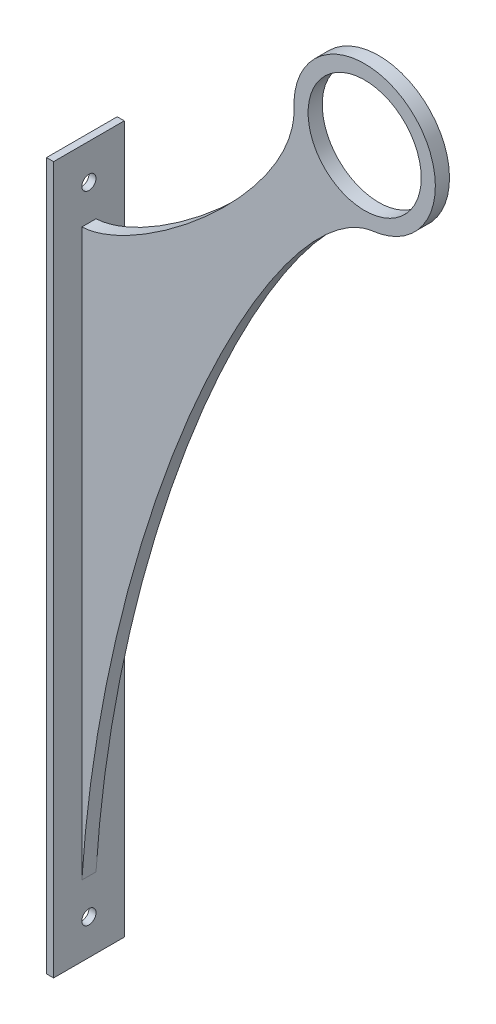
ISO-10303-21;
HEADER;
FILE_DESCRIPTION(('STEP AP214'),'2;1');
FILE_NAME('part.step','',(''),(''),'','','');
FILE_SCHEMA(('AUTOMOTIVE_DESIGN { 1 0 10303 214 1 1 1 1 }'));
ENDSEC;
DATA;
#1=APPLICATION_CONTEXT('core data for automotive mechanical design processes');
#2=APPLICATION_PROTOCOL_DEFINITION('international standard','automotive_design',2000,#1);
#3=PRODUCT_CONTEXT('',#1,'mechanical');
#4=PRODUCT('Part','Part','',(#3));
#5=PRODUCT_RELATED_PRODUCT_CATEGORY('part','',(#4));
#6=PRODUCT_DEFINITION_FORMATION('','',#4);
#7=PRODUCT_DEFINITION_CONTEXT('part definition',#1,'design');
#8=PRODUCT_DEFINITION('design','',#6,#7);
#9=PRODUCT_DEFINITION_SHAPE('','',#8);
#10=(LENGTH_UNIT() NAMED_UNIT(*) SI_UNIT(.MILLI.,.METRE.));
#11=(NAMED_UNIT(*) PLANE_ANGLE_UNIT() SI_UNIT($,.RADIAN.));
#12=(NAMED_UNIT(*) SI_UNIT($,.STERADIAN.) SOLID_ANGLE_UNIT());
#13=UNCERTAINTY_MEASURE_WITH_UNIT(LENGTH_MEASURE(1.E-05),#10,'distance_accuracy_value','');
#14=(GEOMETRIC_REPRESENTATION_CONTEXT(3) GLOBAL_UNCERTAINTY_ASSIGNED_CONTEXT((#13)) GLOBAL_UNIT_ASSIGNED_CONTEXT((#10,
#11,#12)) REPRESENTATION_CONTEXT('',''));
#15=CARTESIAN_POINT('',(0.,0.,0.));
#16=DIRECTION('',(0.,0.,1.));
#17=DIRECTION('',(1.,0.,0.));
#18=AXIS2_PLACEMENT_3D('',#15,#16,#17);
#19=CARTESIAN_POINT('',(51.,0.,-1.00000000000001));
#20=DIRECTION('',(0.,0.,-1.));
#21=DIRECTION('',(0.,1.,0.));
#22=AXIS2_PLACEMENT_3D('',#19,#20,#21);
#23=PLANE('',#22);
#24=CARTESIAN_POINT('',(41.,70.,-1.));
#25=DIRECTION('',(0.,0.,-1.));
#26=DIRECTION('',(0.,1.,0.));
#27=AXIS2_PLACEMENT_3D('',#24,#25,#26);
#28=CIRCLE('',#27,8.);
#29=CARTESIAN_POINT('',(41.,78.,-1.));
#30=VERTEX_POINT('',#29);
#31=EDGE_CURVE('E240',#30,#30,#28,.T.);
#32=ORIENTED_EDGE('',*,*,#31,.F.);
#33=EDGE_LOOP('',(#32));
#34=FACE_BOUND('',#33,.T.);
#35=CARTESIAN_POINT('',(1.,40.,-1.00000000000001));
#36=CARTESIAN_POINT('',(9.64918232550717,40.4235237753895,-1.00000000000001));
#37=CARTESIAN_POINT('',(31.8724041452794,58.9217393643357,-1.00000000000001));
#38=CARTESIAN_POINT('',(31.,70.,-1.00000000000001));
#39=B_SPLINE_CURVE_WITH_KNOTS('',3,(#35,#36,#37,#38),.UNSPECIFIED.,.F.,.F.,(4,4),(0.,1.),.UNSPECIFIED.);
#40=CARTESIAN_POINT('',(31.0247735883734,69.2965385321235,-1.00000000000001));
#41=VERTEX_POINT('',#40);
#42=CARTESIAN_POINT('',(1.,40.,-1.00000000000001));
#43=VERTEX_POINT('',#42);
#44=EDGE_CURVE('E248',#41,#43,#39,.F.);
#45=ORIENTED_EDGE('',*,*,#44,.F.);
#46=CARTESIAN_POINT('',(41.,70.,-1.));
#47=DIRECTION('',(0.,0.,-1.));
#48=DIRECTION('',(0.,1.,0.));
#49=AXIS2_PLACEMENT_3D('',#46,#47,#48);
#50=CIRCLE('',#49,10.);
#51=CARTESIAN_POINT('',(42.1006942420899,60.060760985597,-1.));
#52=VERTEX_POINT('',#51);
#53=EDGE_CURVE('E309',#41,#52,#50,.T.);
#54=ORIENTED_EDGE('',*,*,#53,.T.);
#55=CARTESIAN_POINT('',(1.,-40.,-1.00000000000001));
#56=CARTESIAN_POINT('',(4.19474836503563,9.50313980272918,-1.00000000000001));
#57=CARTESIAN_POINT('',(28.5702411086224,58.1745367645493,-1.00000000000001));
#58=CARTESIAN_POINT('',(42.1006942420899,60.060760985597,-1.00000000000001));
#59=B_SPLINE_CURVE_WITH_KNOTS('',3,(#55,#56,#57,#58),.UNSPECIFIED.,.F.,.F.,(4,4),(0.,1.),.UNSPECIFIED.);
#60=CARTESIAN_POINT('',(1.,-40.,-1.));
#61=VERTEX_POINT('',#60);
#62=EDGE_CURVE('E296',#52,#61,#59,.F.);
#63=ORIENTED_EDGE('',*,*,#62,.T.);
#64=DIRECTION('',(0.,-1.,0.));
#65=VECTOR('',#64,1.);
#66=CARTESIAN_POINT('',(1.,0.,-1.00000000000001));
#67=LINE('',#66,#65);
#68=EDGE_CURVE('E12',#43,#61,#67,.T.);
#69=ORIENTED_EDGE('',*,*,#68,.F.);
#70=EDGE_LOOP('',(#45,#54,#63,#69));
#71=FACE_BOUND('',#70,.T.);
#72=ADVANCED_FACE('F153',(#34,#71),#23,.T.);
#73=CARTESIAN_POINT('',(51.,0.,1.));
#74=DIRECTION('',(0.,0.,1.));
#75=DIRECTION('',(1.,0.,0.));
#76=AXIS2_PLACEMENT_3D('',#73,#74,#75);
#77=PLANE('',#76);
#78=CARTESIAN_POINT('',(41.,70.,1.));
#79=DIRECTION('',(0.,0.,1.));
#80=DIRECTION('',(1.,0.,0.));
#81=AXIS2_PLACEMENT_3D('',#78,#79,#80);
#82=CIRCLE('',#81,8.);
#83=CARTESIAN_POINT('',(49.,70.,1.));
#84=VERTEX_POINT('',#83);
#85=EDGE_CURVE('E494',#84,#84,#82,.T.);
#86=ORIENTED_EDGE('',*,*,#85,.F.);
#87=EDGE_LOOP('',(#86));
#88=FACE_BOUND('',#87,.T.);
#89=CARTESIAN_POINT('',(41.,70.,1.));
#90=DIRECTION('',(0.,0.,1.));
#91=DIRECTION('',(1.,0.,0.));
#92=AXIS2_PLACEMENT_3D('',#89,#90,#91);
#93=CIRCLE('',#92,10.);
#94=CARTESIAN_POINT('',(42.1006942420899,60.060760985597,1.));
#95=VERTEX_POINT('',#94);
#96=CARTESIAN_POINT('',(31.0247735883734,69.2965385321235,1.));
#97=VERTEX_POINT('',#96);
#98=EDGE_CURVE('E239',#95,#97,#93,.T.);
#99=ORIENTED_EDGE('',*,*,#98,.T.);
#100=CARTESIAN_POINT('',(1.,40.,1.));
#101=CARTESIAN_POINT('',(9.64918232550717,40.4235237753895,1.));
#102=CARTESIAN_POINT('',(31.8724041452794,58.9217393643357,1.));
#103=CARTESIAN_POINT('',(31.,70.,1.));
#104=B_SPLINE_CURVE_WITH_KNOTS('',3,(#100,#101,#102,#103),.UNSPECIFIED.,.F.,.F.,(4,4),(0.,1.),.UNSPECIFIED.);
#105=CARTESIAN_POINT('',(1.,40.,1.));
#106=VERTEX_POINT('',#105);
#107=EDGE_CURVE('E245',#106,#97,#104,.T.);
#108=ORIENTED_EDGE('',*,*,#107,.F.);
#109=DIRECTION('',(0.,1.,0.));
#110=VECTOR('',#109,1.);
#111=CARTESIAN_POINT('',(1.,0.,1.));
#112=LINE('',#111,#110);
#113=CARTESIAN_POINT('',(1.,-40.,1.));
#114=VERTEX_POINT('',#113);
#115=EDGE_CURVE('E243',#114,#106,#112,.T.);
#116=ORIENTED_EDGE('',*,*,#115,.F.);
#117=CARTESIAN_POINT('',(1.,-40.,1.));
#118=CARTESIAN_POINT('',(4.19474836503563,9.50313980272918,1.));
#119=CARTESIAN_POINT('',(28.5702411086224,58.1745367645493,1.));
#120=CARTESIAN_POINT('',(42.1006942420899,60.060760985597,1.));
#121=B_SPLINE_CURVE_WITH_KNOTS('',3,(#117,#118,#119,#120),.UNSPECIFIED.,.F.,.F.,(4,4),(0.,1.),.UNSPECIFIED.);
#122=EDGE_CURVE('E228',#114,#95,#121,.T.);
#123=ORIENTED_EDGE('',*,*,#122,.T.);
#124=EDGE_LOOP('',(#99,#108,#116,#123));
#125=FACE_BOUND('',#124,.T.);
#126=ADVANCED_FACE('F244',(#88,#125),#77,.T.);
#127=CARTESIAN_POINT('',(1.,-50.,-5.));
#128=DIRECTION('',(0.,0.,1.));
#129=DIRECTION('',(1.,0.,0.));
#130=AXIS2_PLACEMENT_3D('',#127,#128,#129);
#131=PLANE('',#130);
#132=DIRECTION('',(0.,1.,0.));
#133=VECTOR('',#132,1.);
#134=CARTESIAN_POINT('',(0.,-50.,-5.));
#135=LINE('',#134,#133);
#136=CARTESIAN_POINT('',(0.,-50.,-5.));
#137=VERTEX_POINT('',#136);
#138=CARTESIAN_POINT('',(0.,50.,-5.));
#139=VERTEX_POINT('',#138);
#140=EDGE_CURVE('E253',#137,#139,#135,.T.);
#141=ORIENTED_EDGE('',*,*,#140,.T.);
#142=DIRECTION('',(-1.,0.,0.));
#143=VECTOR('',#142,1.);
#144=CARTESIAN_POINT('',(1.,50.,-5.));
#145=LINE('',#144,#143);
#146=CARTESIAN_POINT('',(1.,50.,-5.));
#147=VERTEX_POINT('',#146);
#148=EDGE_CURVE('E163',#147,#139,#145,.T.);
#149=ORIENTED_EDGE('',*,*,#148,.F.);
#150=DIRECTION('',(0.,1.,0.));
#151=VECTOR('',#150,1.);
#152=CARTESIAN_POINT('',(1.,-50.,-5.));
#153=LINE('',#152,#151);
#154=CARTESIAN_POINT('',(1.,-50.,-5.));
#155=VERTEX_POINT('',#154);
#156=EDGE_CURVE('E205',#155,#147,#153,.T.);
#157=ORIENTED_EDGE('',*,*,#156,.F.);
#158=DIRECTION('',(-1.,0.,0.));
#159=VECTOR('',#158,1.);
#160=CARTESIAN_POINT('',(1.,-50.,-5.));
#161=LINE('',#160,#159);
#162=EDGE_CURVE('E271',#155,#137,#161,.T.);
#163=ORIENTED_EDGE('',*,*,#162,.T.);
#164=EDGE_LOOP('',(#141,#149,#157,#163));
#165=FACE_BOUND('',#164,.T.);
#166=ADVANCED_FACE('F155',(#165),#131,.F.);
#167=CARTESIAN_POINT('',(1.,50.,5.));
#168=DIRECTION('',(0.,-1.,0.));
#169=DIRECTION('',(0.,0.,-1.));
#170=AXIS2_PLACEMENT_3D('',#167,#168,#169);
#171=PLANE('',#170);
#172=DIRECTION('',(0.,0.,1.));
#173=VECTOR('',#172,1.);
#174=CARTESIAN_POINT('',(0.,50.,5.));
#175=LINE('',#174,#173);
#176=CARTESIAN_POINT('',(0.,50.,5.));
#177=VERTEX_POINT('',#176);
#178=EDGE_CURVE('E257',#139,#177,#175,.T.);
#179=ORIENTED_EDGE('',*,*,#178,.T.);
#180=DIRECTION('',(-1.,0.,0.));
#181=VECTOR('',#180,1.);
#182=CARTESIAN_POINT('',(1.,50.,5.));
#183=LINE('',#182,#181);
#184=CARTESIAN_POINT('',(1.,50.,5.));
#185=VERTEX_POINT('',#184);
#186=EDGE_CURVE('E264',#185,#177,#183,.T.);
#187=ORIENTED_EDGE('',*,*,#186,.F.);
#188=DIRECTION('',(0.,0.,1.));
#189=VECTOR('',#188,1.);
#190=CARTESIAN_POINT('',(1.,50.,5.));
#191=LINE('',#190,#189);
#192=EDGE_CURVE('E286',#147,#185,#191,.T.);
#193=ORIENTED_EDGE('',*,*,#192,.F.);
#194=ORIENTED_EDGE('',*,*,#148,.T.);
#195=EDGE_LOOP('',(#179,#187,#193,#194));
#196=FACE_BOUND('',#195,.T.);
#197=ADVANCED_FACE('F361',(#196),#171,.F.);
#198=CARTESIAN_POINT('',(1.,-50.,5.));
#199=DIRECTION('',(0.,0.,-1.));
#200=DIRECTION('',(-1.,0.,0.));
#201=AXIS2_PLACEMENT_3D('',#198,#199,#200);
#202=PLANE('',#201);
#203=DIRECTION('',(0.,-1.,0.));
#204=VECTOR('',#203,1.);
#205=CARTESIAN_POINT('',(0.,-50.,5.));
#206=LINE('',#205,#204);
#207=CARTESIAN_POINT('',(0.,-50.,5.));
#208=VERTEX_POINT('',#207);
#209=EDGE_CURVE('E276',#177,#208,#206,.T.);
#210=ORIENTED_EDGE('',*,*,#209,.T.);
#211=DIRECTION('',(-1.,0.,0.));
#212=VECTOR('',#211,1.);
#213=CARTESIAN_POINT('',(1.,-50.,5.));
#214=LINE('',#213,#212);
#215=CARTESIAN_POINT('',(1.,-50.,5.));
#216=VERTEX_POINT('',#215);
#217=EDGE_CURVE('E268',#216,#208,#214,.T.);
#218=ORIENTED_EDGE('',*,*,#217,.F.);
#219=DIRECTION('',(0.,-1.,0.));
#220=VECTOR('',#219,1.);
#221=CARTESIAN_POINT('',(1.,-50.,5.));
#222=LINE('',#221,#220);
#223=EDGE_CURVE('E283',#185,#216,#222,.T.);
#224=ORIENTED_EDGE('',*,*,#223,.F.);
#225=ORIENTED_EDGE('',*,*,#186,.T.);
#226=EDGE_LOOP('',(#210,#218,#224,#225));
#227=FACE_BOUND('',#226,.T.);
#228=ADVANCED_FACE('F359',(#227),#202,.F.);
#229=CARTESIAN_POINT('',(1.,-50.,5.));
#230=DIRECTION('',(0.,1.,0.));
#231=DIRECTION('',(0.,0.,1.));
#232=AXIS2_PLACEMENT_3D('',#229,#230,#231);
#233=PLANE('',#232);
#234=DIRECTION('',(0.,0.,-1.));
#235=VECTOR('',#234,1.);
#236=CARTESIAN_POINT('',(0.,-50.,5.));
#237=LINE('',#236,#235);
#238=EDGE_CURVE('E200',#208,#137,#237,.T.);
#239=ORIENTED_EDGE('',*,*,#238,.T.);
#240=ORIENTED_EDGE('',*,*,#162,.F.);
#241=DIRECTION('',(0.,0.,-1.));
#242=VECTOR('',#241,1.);
#243=CARTESIAN_POINT('',(1.,-50.,5.));
#244=LINE('',#243,#242);
#245=EDGE_CURVE('E179',#216,#155,#244,.T.);
#246=ORIENTED_EDGE('',*,*,#245,.F.);
#247=ORIENTED_EDGE('',*,*,#217,.T.);
#248=EDGE_LOOP('',(#239,#240,#246,#247));
#249=FACE_BOUND('',#248,.T.);
#250=ADVANCED_FACE('F352',(#249),#233,.F.);
#251=CARTESIAN_POINT('',(1.,0.,0.));
#252=DIRECTION('',(-1.,0.,0.));
#253=DIRECTION('',(0.,0.,1.));
#254=AXIS2_PLACEMENT_3D('',#251,#252,#253);
#255=PLANE('',#254);
#256=CARTESIAN_POINT('',(1.,-45.,0.));
#257=DIRECTION('',(-1.,0.,0.));
#258=DIRECTION('',(0.,0.,1.));
#259=AXIS2_PLACEMENT_3D('',#256,#257,#258);
#260=CIRCLE('',#259,1.);
#261=CARTESIAN_POINT('',(1.,-45.,1.));
#262=VERTEX_POINT('',#261);
#263=EDGE_CURVE('E480',#262,#262,#260,.T.);
#264=ORIENTED_EDGE('',*,*,#263,.T.);
#265=EDGE_LOOP('',(#264));
#266=FACE_BOUND('',#265,.T.);
#267=CARTESIAN_POINT('',(1.,44.9643549782266,0.));
#268=DIRECTION('',(-1.,0.,0.));
#269=DIRECTION('',(0.,0.,1.));
#270=AXIS2_PLACEMENT_3D('',#267,#268,#269);
#271=CIRCLE('',#270,1.);
#272=CARTESIAN_POINT('',(1.,44.9643549782266,1.));
#273=VERTEX_POINT('',#272);
#274=EDGE_CURVE('E490',#273,#273,#271,.T.);
#275=ORIENTED_EDGE('',*,*,#274,.T.);
#276=EDGE_LOOP('',(#275));
#277=FACE_BOUND('',#276,.T.);
#278=ORIENTED_EDGE('',*,*,#68,.T.);
#279=DIRECTION('',(0.,0.,-1.));
#280=VECTOR('',#279,1.);
#281=CARTESIAN_POINT('',(1.,-40.,0.));
#282=LINE('',#281,#280);
#283=EDGE_CURVE('E232',#114,#61,#282,.T.);
#284=ORIENTED_EDGE('',*,*,#283,.F.);
#285=ORIENTED_EDGE('',*,*,#115,.T.);
#286=DIRECTION('',(0.,0.,1.));
#287=VECTOR('',#286,1.);
#288=CARTESIAN_POINT('',(1.,40.,-49.));
#289=LINE('',#288,#287);
#290=EDGE_CURVE('E170',#43,#106,#289,.T.);
#291=ORIENTED_EDGE('',*,*,#290,.F.);
#292=EDGE_LOOP('',(#278,#284,#285,#291));
#293=FACE_BOUND('',#292,.T.);
#294=ORIENTED_EDGE('',*,*,#156,.T.);
#295=ORIENTED_EDGE('',*,*,#192,.T.);
#296=ORIENTED_EDGE('',*,*,#223,.T.);
#297=ORIENTED_EDGE('',*,*,#245,.T.);
#298=EDGE_LOOP('',(#294,#295,#296,#297));
#299=FACE_BOUND('',#298,.T.);
#300=ADVANCED_FACE('F250',(#266,#277,#293,#299),#255,.F.);
#301=CARTESIAN_POINT('',(0.,0.,0.));
#302=DIRECTION('',(-1.,0.,0.));
#303=DIRECTION('',(0.,0.,1.));
#304=AXIS2_PLACEMENT_3D('',#301,#302,#303);
#305=PLANE('',#304);
#306=CARTESIAN_POINT('',(0.,-45.,0.));
#307=DIRECTION('',(-1.,0.,0.));
#308=DIRECTION('',(0.,0.,1.));
#309=AXIS2_PLACEMENT_3D('',#306,#307,#308);
#310=CIRCLE('',#309,1.);
#311=CARTESIAN_POINT('',(0.,-45.,1.));
#312=VERTEX_POINT('',#311);
#313=EDGE_CURVE('E483',#312,#312,#310,.T.);
#314=ORIENTED_EDGE('',*,*,#313,.F.);
#315=EDGE_LOOP('',(#314));
#316=FACE_BOUND('',#315,.T.);
#317=CARTESIAN_POINT('',(0.,44.9643549782266,0.));
#318=DIRECTION('',(-1.,0.,0.));
#319=DIRECTION('',(0.,0.,1.));
#320=AXIS2_PLACEMENT_3D('',#317,#318,#319);
#321=CIRCLE('',#320,1.);
#322=CARTESIAN_POINT('',(0.,44.9643549782266,1.));
#323=VERTEX_POINT('',#322);
#324=EDGE_CURVE('E487',#323,#323,#321,.T.);
#325=ORIENTED_EDGE('',*,*,#324,.F.);
#326=EDGE_LOOP('',(#325));
#327=FACE_BOUND('',#326,.T.);
#328=ORIENTED_EDGE('',*,*,#140,.F.);
#329=ORIENTED_EDGE('',*,*,#238,.F.);
#330=ORIENTED_EDGE('',*,*,#209,.F.);
#331=ORIENTED_EDGE('',*,*,#178,.F.);
#332=EDGE_LOOP('',(#328,#329,#330,#331));
#333=FACE_BOUND('',#332,.T.);
#334=ADVANCED_FACE('F351',(#316,#327,#333),#305,.T.);
#335=CARTESIAN_POINT('',(1.,-40.,-49.));
#336=CARTESIAN_POINT('',(4.19474836503563,9.50313980272918,-49.));
#337=CARTESIAN_POINT('',(28.5702411086224,58.1745367645493,-49.));
#338=CARTESIAN_POINT('',(42.1006942420899,60.060760985597,-49.));
#339=B_SPLINE_CURVE_WITH_KNOTS('',3,(#335,#336,#337,#338),.UNSPECIFIED.,.F.,.F.,(4,4),(0.,1.),.UNSPECIFIED.);
#340=DIRECTION('',(0.,0.,1.));
#341=VECTOR('',#340,1.);
#342=SURFACE_OF_LINEAR_EXTRUSION('',#339,#341);
#343=DIRECTION('',(0.,0.,1.));
#344=VECTOR('',#343,1.);
#345=CARTESIAN_POINT('',(42.1006942420899,60.060760985597,-49.));
#346=LINE('',#345,#344);
#347=EDGE_CURVE('E235',#52,#95,#346,.T.);
#348=ORIENTED_EDGE('',*,*,#347,.T.);
#349=ORIENTED_EDGE('',*,*,#122,.F.);
#350=ORIENTED_EDGE('',*,*,#283,.T.);
#351=ORIENTED_EDGE('',*,*,#62,.F.);
#352=EDGE_LOOP('',(#348,#349,#350,#351));
#353=FACE_BOUND('',#352,.T.);
#354=ADVANCED_FACE('F230',(#353),#342,.T.);
#355=CARTESIAN_POINT('',(41.,70.,-49.));
#356=DIRECTION('',(0.,0.,1.));
#357=DIRECTION('',(1.,0.,0.));
#358=AXIS2_PLACEMENT_3D('',#355,#356,#357);
#359=CYLINDRICAL_SURFACE('',#358,10.);
#360=ORIENTED_EDGE('',*,*,#53,.F.);
#361=DIRECTION('',(0.,0.,1.));
#362=VECTOR('',#361,1.);
#363=CARTESIAN_POINT('',(31.0247735883734,69.2965385321235,-49.));
#364=LINE('',#363,#362);
#365=EDGE_CURVE('E313',#41,#97,#364,.T.);
#366=ORIENTED_EDGE('',*,*,#365,.T.);
#367=ORIENTED_EDGE('',*,*,#98,.F.);
#368=ORIENTED_EDGE('',*,*,#347,.F.);
#369=EDGE_LOOP('',(#360,#366,#367,#368));
#370=FACE_BOUND('',#369,.T.);
#371=ADVANCED_FACE('F340',(#370),#359,.T.);
#372=CARTESIAN_POINT('',(1.,40.,-49.));
#373=CARTESIAN_POINT('',(9.64918232550717,40.4235237753895,-49.));
#374=CARTESIAN_POINT('',(31.8724041452794,58.9217393643357,-49.));
#375=CARTESIAN_POINT('',(31.,70.,-49.));
#376=B_SPLINE_CURVE_WITH_KNOTS('',3,(#372,#373,#374,#375),.UNSPECIFIED.,.F.,.F.,(4,4),(0.,1.),.UNSPECIFIED.);
#377=DIRECTION('',(0.,0.,1.));
#378=VECTOR('',#377,1.);
#379=SURFACE_OF_LINEAR_EXTRUSION('',#376,#378);
#380=ORIENTED_EDGE('',*,*,#44,.T.);
#381=ORIENTED_EDGE('',*,*,#290,.T.);
#382=ORIENTED_EDGE('',*,*,#107,.T.);
#383=ORIENTED_EDGE('',*,*,#365,.F.);
#384=EDGE_LOOP('',(#380,#381,#382,#383));
#385=FACE_BOUND('',#384,.T.);
#386=ADVANCED_FACE('F335',(#385),#379,.F.);
#387=CARTESIAN_POINT('',(41.,70.,-49.));
#388=DIRECTION('',(0.,0.,1.));
#389=DIRECTION('',(1.,0.,0.));
#390=AXIS2_PLACEMENT_3D('',#387,#388,#389);
#391=CYLINDRICAL_SURFACE('',#390,8.);
#392=ORIENTED_EDGE('',*,*,#31,.T.);
#393=EDGE_LOOP('',(#392));
#394=FACE_BOUND('',#393,.T.);
#395=ORIENTED_EDGE('',*,*,#85,.T.);
#396=EDGE_LOOP('',(#395));
#397=FACE_BOUND('',#396,.T.);
#398=ADVANCED_FACE('F339',(#394,#397),#391,.F.);
#399=CARTESIAN_POINT('',(1.,44.9643549782266,0.));
#400=DIRECTION('',(-1.,0.,0.));
#401=DIRECTION('',(0.,0.,1.));
#402=AXIS2_PLACEMENT_3D('',#399,#400,#401);
#403=CYLINDRICAL_SURFACE('',#402,1.);
#404=ORIENTED_EDGE('',*,*,#274,.F.);
#405=EDGE_LOOP('',(#404));
#406=FACE_BOUND('',#405,.T.);
#407=ORIENTED_EDGE('',*,*,#324,.T.);
#408=EDGE_LOOP('',(#407));
#409=FACE_BOUND('',#408,.T.);
#410=ADVANCED_FACE('F440',(#406,#409),#403,.F.);
#411=CARTESIAN_POINT('',(1.,-45.,0.));
#412=DIRECTION('',(-1.,0.,0.));
#413=DIRECTION('',(0.,0.,1.));
#414=AXIS2_PLACEMENT_3D('',#411,#412,#413);
#415=CYLINDRICAL_SURFACE('',#414,1.);
#416=ORIENTED_EDGE('',*,*,#263,.F.);
#417=EDGE_LOOP('',(#416));
#418=FACE_BOUND('',#417,.T.);
#419=ORIENTED_EDGE('',*,*,#313,.T.);
#420=EDGE_LOOP('',(#419));
#421=FACE_BOUND('',#420,.T.);
#422=ADVANCED_FACE('F450',(#418,#421),#415,.F.);
#423=CLOSED_SHELL('',(#72,#126,#166,#197,#228,#250,#300,#334,#354,#371,#386,#398,#410,#422));
#424=MANIFOLD_SOLID_BREP('B2',#423);
#425=ADVANCED_BREP_SHAPE_REPRESENTATION('',(#18,#424),#14);
#426=SHAPE_DEFINITION_REPRESENTATION(#9,#425);
ENDSEC;
END-ISO-10303-21;
